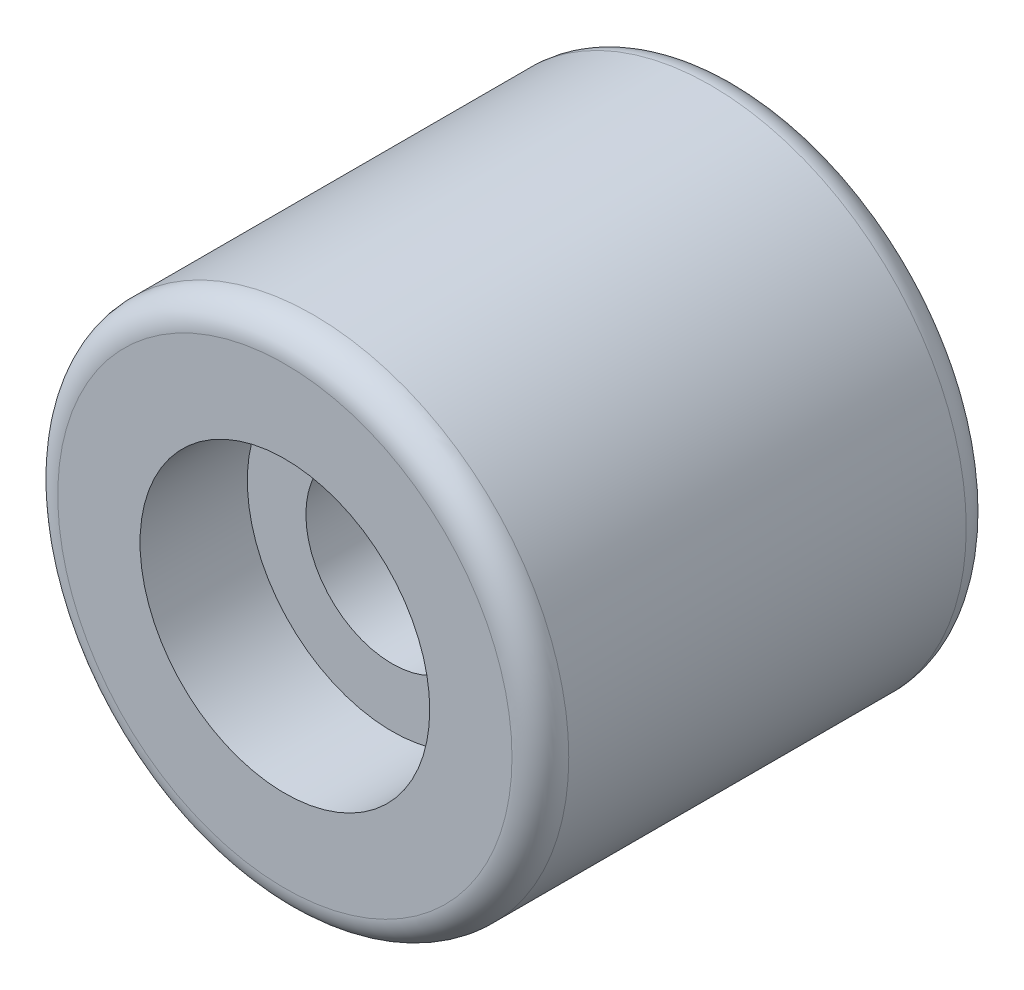
ISO-10303-21;
HEADER;
FILE_DESCRIPTION(('STEP AP214'),'2;1');
FILE_NAME('part.step','',(''),(''),'','','');
FILE_SCHEMA(('AUTOMOTIVE_DESIGN { 1 0 10303 214 1 1 1 1 }'));
ENDSEC;
DATA;
#1=APPLICATION_CONTEXT('core data for automotive mechanical design processes');
#2=APPLICATION_PROTOCOL_DEFINITION('international standard','automotive_design',2000,#1);
#3=PRODUCT_CONTEXT('',#1,'mechanical');
#4=PRODUCT('Part','Part','',(#3));
#5=PRODUCT_RELATED_PRODUCT_CATEGORY('part','',(#4));
#6=PRODUCT_DEFINITION_FORMATION('','',#4);
#7=PRODUCT_DEFINITION_CONTEXT('part definition',#1,'design');
#8=PRODUCT_DEFINITION('design','',#6,#7);
#9=PRODUCT_DEFINITION_SHAPE('','',#8);
#10=(LENGTH_UNIT() NAMED_UNIT(*) SI_UNIT(.MILLI.,.METRE.));
#11=(NAMED_UNIT(*) PLANE_ANGLE_UNIT() SI_UNIT($,.RADIAN.));
#12=(NAMED_UNIT(*) SI_UNIT($,.STERADIAN.) SOLID_ANGLE_UNIT());
#13=UNCERTAINTY_MEASURE_WITH_UNIT(LENGTH_MEASURE(1.E-05),#10,'distance_accuracy_value','');
#14=(GEOMETRIC_REPRESENTATION_CONTEXT(3) GLOBAL_UNCERTAINTY_ASSIGNED_CONTEXT((#13)) GLOBAL_UNIT_ASSIGNED_CONTEXT((#10,
#11,#12)) REPRESENTATION_CONTEXT('',''));
#15=CARTESIAN_POINT('',(0.,0.,0.));
#16=DIRECTION('',(0.,0.,1.));
#17=DIRECTION('',(1.,0.,0.));
#18=AXIS2_PLACEMENT_3D('',#15,#16,#17);
#19=CARTESIAN_POINT('',(0.,0.,12.7));
#20=DIRECTION('',(0.,0.,-1.));
#21=DIRECTION('',(-1.,0.,0.));
#22=AXIS2_PLACEMENT_3D('',#19,#20,#21);
#23=CYLINDRICAL_SURFACE('',#22,2.413);
#24=CARTESIAN_POINT('',(0.,0.,9.7));
#25=DIRECTION('',(0.,0.,1.));
#26=DIRECTION('',(1.,0.,0.));
#27=AXIS2_PLACEMENT_3D('',#24,#25,#26);
#28=CIRCLE('',#27,2.413);
#29=CARTESIAN_POINT('',(2.413,0.,9.7));
#30=VERTEX_POINT('',#29);
#31=EDGE_CURVE('E66',#30,#30,#28,.T.);
#32=ORIENTED_EDGE('',*,*,#31,.T.);
#33=EDGE_LOOP('',(#32));
#34=FACE_BOUND('',#33,.T.);
#35=CARTESIAN_POINT('',(0.,0.,3.));
#36=DIRECTION('',(0.,0.,-1.));
#37=DIRECTION('',(-1.,0.,0.));
#38=AXIS2_PLACEMENT_3D('',#35,#36,#37);
#39=CIRCLE('',#38,2.413);
#40=CARTESIAN_POINT('',(-2.413,0.,3.));
#41=VERTEX_POINT('',#40);
#42=EDGE_CURVE('E67',#41,#41,#39,.T.);
#43=ORIENTED_EDGE('',*,*,#42,.T.);
#44=EDGE_LOOP('',(#43));
#45=FACE_BOUND('',#44,.T.);
#46=ADVANCED_FACE('F42',(#34,#45),#23,.F.);
#47=CARTESIAN_POINT('',(0.,0.,12.7));
#48=DIRECTION('',(0.,0.,1.));
#49=DIRECTION('',(1.,0.,0.));
#50=AXIS2_PLACEMENT_3D('',#47,#48,#49);
#51=PLANE('',#50);
#52=CARTESIAN_POINT('',(0.,0.,12.7));
#53=DIRECTION('',(0.,0.,1.));
#54=DIRECTION('',(1.,0.,0.));
#55=AXIS2_PLACEMENT_3D('',#52,#53,#54);
#56=CIRCLE('',#55,6.35);
#57=CARTESIAN_POINT('',(6.35,0.,12.7));
#58=VERTEX_POINT('',#57);
#59=EDGE_CURVE('E60',#58,#58,#56,.T.);
#60=ORIENTED_EDGE('',*,*,#59,.T.);
#61=EDGE_LOOP('',(#60));
#62=FACE_BOUND('',#61,.T.);
#63=CARTESIAN_POINT('',(0.,0.,12.7));
#64=DIRECTION('',(0.,0.,1.));
#65=DIRECTION('',(1.,0.,0.));
#66=AXIS2_PLACEMENT_3D('',#63,#64,#65);
#67=CIRCLE('',#66,4.05);
#68=CARTESIAN_POINT('',(4.05,0.,12.7));
#69=VERTEX_POINT('',#68);
#70=EDGE_CURVE('E71',#69,#69,#67,.T.);
#71=ORIENTED_EDGE('',*,*,#70,.F.);
#72=EDGE_LOOP('',(#71));
#73=FACE_BOUND('',#72,.T.);
#74=ADVANCED_FACE('F103',(#62,#73),#51,.T.);
#75=CARTESIAN_POINT('',(0.,0.,0.));
#76=DIRECTION('',(0.,0.,1.));
#77=DIRECTION('',(1.,0.,0.));
#78=AXIS2_PLACEMENT_3D('',#75,#76,#77);
#79=PLANE('',#78);
#80=CARTESIAN_POINT('',(0.,0.,0.));
#81=DIRECTION('',(0.,0.,1.));
#82=DIRECTION('',(1.,0.,0.));
#83=AXIS2_PLACEMENT_3D('',#80,#81,#82);
#84=CIRCLE('',#83,6.35);
#85=CARTESIAN_POINT('',(6.35,0.,0.));
#86=VERTEX_POINT('',#85);
#87=EDGE_CURVE('E10',#86,#86,#84,.F.);
#88=ORIENTED_EDGE('',*,*,#87,.T.);
#89=EDGE_LOOP('',(#88));
#90=FACE_BOUND('',#89,.T.);
#91=CARTESIAN_POINT('',(0.,0.,0.));
#92=DIRECTION('',(0.,0.,-1.));
#93=DIRECTION('',(-1.,0.,0.));
#94=AXIS2_PLACEMENT_3D('',#91,#92,#93);
#95=CIRCLE('',#94,4.05);
#96=CARTESIAN_POINT('',(-4.05,0.,0.));
#97=VERTEX_POINT('',#96);
#98=EDGE_CURVE('E83',#97,#97,#95,.T.);
#99=ORIENTED_EDGE('',*,*,#98,.F.);
#100=EDGE_LOOP('',(#99));
#101=FACE_BOUND('',#100,.T.);
#102=ADVANCED_FACE('F100',(#90,#101),#79,.F.);
#103=CARTESIAN_POINT('',(0.,0.,12.7));
#104=DIRECTION('',(0.,0.,-1.));
#105=DIRECTION('',(-1.,0.,0.));
#106=AXIS2_PLACEMENT_3D('',#103,#104,#105);
#107=CYLINDRICAL_SURFACE('',#106,7.14375);
#108=CARTESIAN_POINT('',(0.,0.,11.90625));
#109=DIRECTION('',(0.,0.,1.));
#110=DIRECTION('',(1.,0.,0.));
#111=AXIS2_PLACEMENT_3D('',#108,#109,#110);
#112=CIRCLE('',#111,7.14375);
#113=CARTESIAN_POINT('',(7.14375,0.,11.90625));
#114=VERTEX_POINT('',#113);
#115=EDGE_CURVE('E50',#114,#114,#112,.F.);
#116=ORIENTED_EDGE('',*,*,#115,.T.);
#117=EDGE_LOOP('',(#116));
#118=FACE_BOUND('',#117,.T.);
#119=CARTESIAN_POINT('',(0.,0.,0.793749999999999));
#120=DIRECTION('',(0.,0.,1.));
#121=DIRECTION('',(1.,0.,0.));
#122=AXIS2_PLACEMENT_3D('',#119,#120,#121);
#123=CIRCLE('',#122,7.14375);
#124=CARTESIAN_POINT('',(7.14375,0.,0.793749999999999));
#125=VERTEX_POINT('',#124);
#126=EDGE_CURVE('E55',#125,#125,#123,.T.);
#127=ORIENTED_EDGE('',*,*,#126,.T.);
#128=EDGE_LOOP('',(#127));
#129=FACE_BOUND('',#128,.T.);
#130=ADVANCED_FACE('F102',(#118,#129),#107,.T.);
#131=CARTESIAN_POINT('',(0.,0.,9.7));
#132=DIRECTION('',(0.,0.,1.));
#133=DIRECTION('',(1.,0.,0.));
#134=AXIS2_PLACEMENT_3D('',#131,#132,#133);
#135=CYLINDRICAL_SURFACE('',#134,4.05);
#136=CARTESIAN_POINT('',(0.,0.,9.7));
#137=DIRECTION('',(0.,0.,1.));
#138=DIRECTION('',(1.,0.,0.));
#139=AXIS2_PLACEMENT_3D('',#136,#137,#138);
#140=CIRCLE('',#139,4.05);
#141=CARTESIAN_POINT('',(4.05,0.,9.7));
#142=VERTEX_POINT('',#141);
#143=EDGE_CURVE('E76',#142,#142,#140,.T.);
#144=ORIENTED_EDGE('',*,*,#143,.F.);
#145=EDGE_LOOP('',(#144));
#146=FACE_BOUND('',#145,.T.);
#147=ORIENTED_EDGE('',*,*,#70,.T.);
#148=EDGE_LOOP('',(#147));
#149=FACE_BOUND('',#148,.T.);
#150=ADVANCED_FACE('F109',(#146,#149),#135,.F.);
#151=CARTESIAN_POINT('',(0.,0.,9.7));
#152=DIRECTION('',(0.,0.,1.));
#153=DIRECTION('',(1.,0.,0.));
#154=AXIS2_PLACEMENT_3D('',#151,#152,#153);
#155=PLANE('',#154);
#156=ORIENTED_EDGE('',*,*,#31,.F.);
#157=EDGE_LOOP('',(#156));
#158=FACE_BOUND('',#157,.T.);
#159=ORIENTED_EDGE('',*,*,#143,.T.);
#160=EDGE_LOOP('',(#159));
#161=FACE_BOUND('',#160,.T.);
#162=ADVANCED_FACE('F96',(#158,#161),#155,.T.);
#163=CARTESIAN_POINT('',(0.,0.,3.));
#164=DIRECTION('',(0.,0.,-1.));
#165=DIRECTION('',(-1.,0.,0.));
#166=AXIS2_PLACEMENT_3D('',#163,#164,#165);
#167=CYLINDRICAL_SURFACE('',#166,4.05);
#168=CARTESIAN_POINT('',(0.,0.,3.));
#169=DIRECTION('',(0.,0.,-1.));
#170=DIRECTION('',(-1.,0.,0.));
#171=AXIS2_PLACEMENT_3D('',#168,#169,#170);
#172=CIRCLE('',#171,4.05);
#173=CARTESIAN_POINT('',(-4.05,0.,3.));
#174=VERTEX_POINT('',#173);
#175=EDGE_CURVE('E72',#174,#174,#172,.T.);
#176=ORIENTED_EDGE('',*,*,#175,.F.);
#177=EDGE_LOOP('',(#176));
#178=FACE_BOUND('',#177,.T.);
#179=ORIENTED_EDGE('',*,*,#98,.T.);
#180=EDGE_LOOP('',(#179));
#181=FACE_BOUND('',#180,.T.);
#182=ADVANCED_FACE('F93',(#178,#181),#167,.F.);
#183=CARTESIAN_POINT('',(0.,0.,3.));
#184=DIRECTION('',(0.,0.,-1.));
#185=DIRECTION('',(-1.,0.,0.));
#186=AXIS2_PLACEMENT_3D('',#183,#184,#185);
#187=PLANE('',#186);
#188=ORIENTED_EDGE('',*,*,#42,.F.);
#189=EDGE_LOOP('',(#188));
#190=FACE_BOUND('',#189,.T.);
#191=ORIENTED_EDGE('',*,*,#175,.T.);
#192=EDGE_LOOP('',(#191));
#193=FACE_BOUND('',#192,.T.);
#194=ADVANCED_FACE('F91',(#190,#193),#187,.T.);
#195=CARTESIAN_POINT('',(0.,0.,11.90625));
#196=DIRECTION('',(0.,0.,1.));
#197=DIRECTION('',(1.,0.,0.));
#198=AXIS2_PLACEMENT_3D('',#195,#196,#197);
#199=TOROIDAL_SURFACE('',#198,6.35,0.79375);
#200=ORIENTED_EDGE('',*,*,#115,.F.);
#201=EDGE_LOOP('',(#200));
#202=FACE_BOUND('',#201,.T.);
#203=ORIENTED_EDGE('',*,*,#59,.F.);
#204=EDGE_LOOP('',(#203));
#205=FACE_BOUND('',#204,.T.);
#206=ADVANCED_FACE('F127',(#202,#205),#199,.T.);
#207=CARTESIAN_POINT('',(0.,0.,0.793749999999999));
#208=DIRECTION('',(0.,0.,1.));
#209=DIRECTION('',(1.,0.,0.));
#210=AXIS2_PLACEMENT_3D('',#207,#208,#209);
#211=TOROIDAL_SURFACE('',#210,6.35,0.79375);
#212=ORIENTED_EDGE('',*,*,#87,.F.);
#213=EDGE_LOOP('',(#212));
#214=FACE_BOUND('',#213,.T.);
#215=ORIENTED_EDGE('',*,*,#126,.F.);
#216=EDGE_LOOP('',(#215));
#217=FACE_BOUND('',#216,.T.);
#218=ADVANCED_FACE('F44',(#214,#217),#211,.T.);
#219=CLOSED_SHELL('',(#46,#74,#102,#130,#150,#162,#182,#194,#206,#218));
#220=MANIFOLD_SOLID_BREP('B2',#219);
#221=ADVANCED_BREP_SHAPE_REPRESENTATION('',(#18,#220),#14);
#222=SHAPE_DEFINITION_REPRESENTATION(#9,#221);
ENDSEC;
END-ISO-10303-21;
